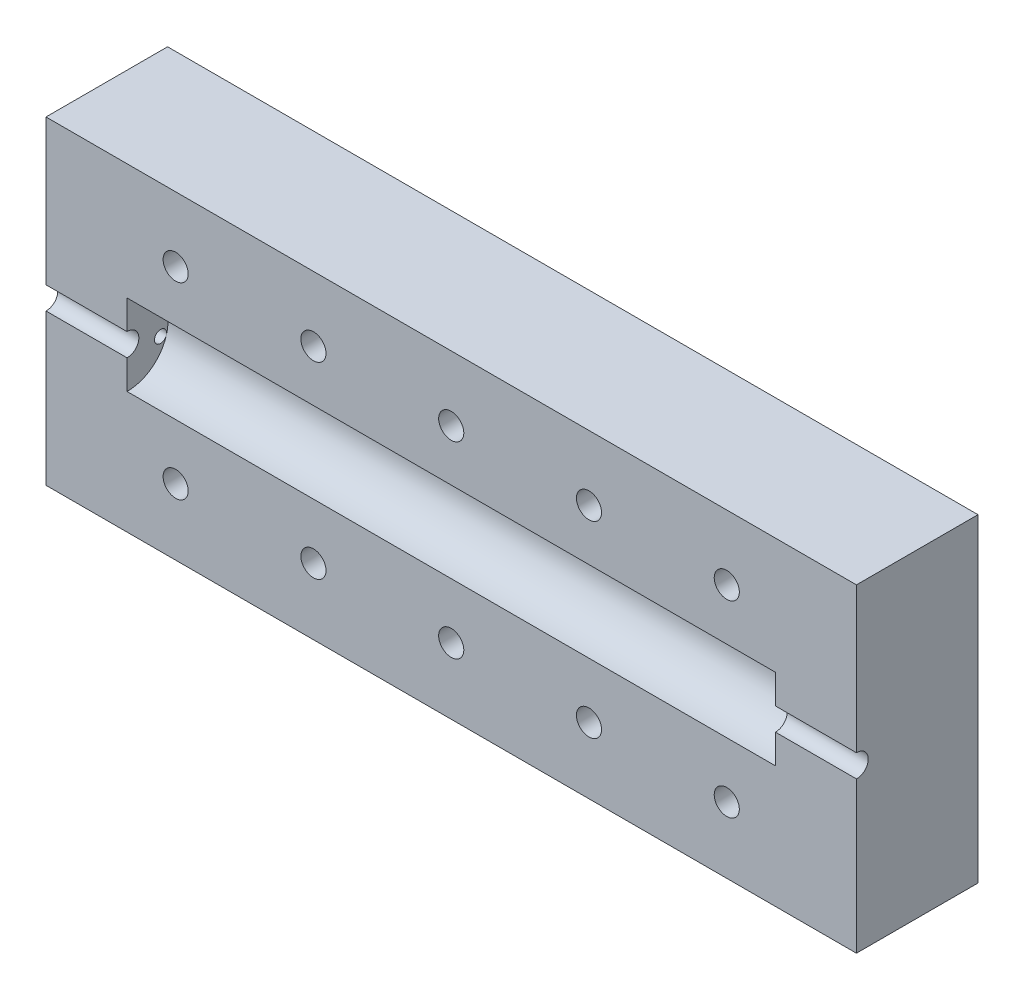
ISO-10303-21;
HEADER;
FILE_DESCRIPTION(('STEP AP214'),'2;1');
FILE_NAME('part.step','',(''),(''),'','','');
FILE_SCHEMA(('AUTOMOTIVE_DESIGN { 1 0 10303 214 1 1 1 1 }'));
ENDSEC;
DATA;
#1=APPLICATION_CONTEXT('core data for automotive mechanical design processes');
#2=APPLICATION_PROTOCOL_DEFINITION('international standard','automotive_design',2000,#1);
#3=PRODUCT_CONTEXT('',#1,'mechanical');
#4=PRODUCT('Part','Part','',(#3));
#5=PRODUCT_RELATED_PRODUCT_CATEGORY('part','',(#4));
#6=PRODUCT_DEFINITION_FORMATION('','',#4);
#7=PRODUCT_DEFINITION_CONTEXT('part definition',#1,'design');
#8=PRODUCT_DEFINITION('design','',#6,#7);
#9=PRODUCT_DEFINITION_SHAPE('','',#8);
#10=(LENGTH_UNIT() NAMED_UNIT(*) SI_UNIT(.MILLI.,.METRE.));
#11=(NAMED_UNIT(*) PLANE_ANGLE_UNIT() SI_UNIT($,.RADIAN.));
#12=(NAMED_UNIT(*) SI_UNIT($,.STERADIAN.) SOLID_ANGLE_UNIT());
#13=UNCERTAINTY_MEASURE_WITH_UNIT(LENGTH_MEASURE(1.E-05),#10,'distance_accuracy_value','');
#14=(GEOMETRIC_REPRESENTATION_CONTEXT(3) GLOBAL_UNCERTAINTY_ASSIGNED_CONTEXT((#13)) GLOBAL_UNIT_ASSIGNED_CONTEXT((#10,
#11,#12)) REPRESENTATION_CONTEXT('',''));
#15=CARTESIAN_POINT('',(0.,0.,0.));
#16=DIRECTION('',(0.,0.,1.));
#17=DIRECTION('',(1.,0.,0.));
#18=AXIS2_PLACEMENT_3D('',#15,#16,#17);
#19=CARTESIAN_POINT('',(67.,31.3641600464409,0.));
#20=DIRECTION('',(0.,0.,1.));
#21=DIRECTION('',(1.,0.,0.));
#22=AXIS2_PLACEMENT_3D('',#19,#20,#21);
#23=CYLINDRICAL_SURFACE('',#22,1.54999999999999);
#24=CARTESIAN_POINT('',(67.,31.3641600464409,15.));
#25=DIRECTION('',(0.,0.,-1.));
#26=DIRECTION('',(-1.,0.,0.));
#27=AXIS2_PLACEMENT_3D('',#24,#25,#26);
#28=CIRCLE('',#27,1.54999999999999);
#29=CARTESIAN_POINT('',(65.45,31.3641600464409,15.));
#30=VERTEX_POINT('',#29);
#31=EDGE_CURVE('E246',#30,#30,#28,.F.);
#32=ORIENTED_EDGE('',*,*,#31,.T.);
#33=EDGE_LOOP('',(#32));
#34=FACE_BOUND('',#33,.T.);
#35=CARTESIAN_POINT('',(67.,31.3641600464409,10.));
#36=DIRECTION('',(0.,0.,-1.));
#37=DIRECTION('',(-1.,0.,0.));
#38=AXIS2_PLACEMENT_3D('',#35,#36,#37);
#39=CIRCLE('',#38,1.54999999999999);
#40=CARTESIAN_POINT('',(65.45,31.3641600464409,10.));
#41=VERTEX_POINT('',#40);
#42=EDGE_CURVE('E161',#41,#41,#39,.F.);
#43=ORIENTED_EDGE('',*,*,#42,.F.);
#44=EDGE_LOOP('',(#43));
#45=FACE_BOUND('',#44,.T.);
#46=ADVANCED_FACE('F35',(#34,#45),#23,.F.);
#47=CARTESIAN_POINT('',(50.,31.3641600464409,0.));
#48=DIRECTION('',(0.,0.,1.));
#49=DIRECTION('',(1.,0.,0.));
#50=AXIS2_PLACEMENT_3D('',#47,#48,#49);
#51=CYLINDRICAL_SURFACE('',#50,1.55);
#52=CARTESIAN_POINT('',(50.,31.3641600464409,15.));
#53=DIRECTION('',(0.,0.,-1.));
#54=DIRECTION('',(-1.,0.,0.));
#55=AXIS2_PLACEMENT_3D('',#52,#53,#54);
#56=CIRCLE('',#55,1.55);
#57=CARTESIAN_POINT('',(48.45,31.3641600464409,15.));
#58=VERTEX_POINT('',#57);
#59=EDGE_CURVE('E243',#58,#58,#56,.F.);
#60=ORIENTED_EDGE('',*,*,#59,.T.);
#61=EDGE_LOOP('',(#60));
#62=FACE_BOUND('',#61,.T.);
#63=CARTESIAN_POINT('',(50.,31.3641600464409,10.));
#64=DIRECTION('',(0.,0.,-1.));
#65=DIRECTION('',(-1.,0.,0.));
#66=AXIS2_PLACEMENT_3D('',#63,#64,#65);
#67=CIRCLE('',#66,1.55);
#68=CARTESIAN_POINT('',(48.45,31.3641600464409,10.));
#69=VERTEX_POINT('',#68);
#70=EDGE_CURVE('E159',#69,#69,#67,.F.);
#71=ORIENTED_EDGE('',*,*,#70,.F.);
#72=EDGE_LOOP('',(#71));
#73=FACE_BOUND('',#72,.T.);
#74=ADVANCED_FACE('F334',(#62,#73),#51,.F.);
#75=CARTESIAN_POINT('',(33.,31.3641600464409,0.));
#76=DIRECTION('',(0.,0.,1.));
#77=DIRECTION('',(1.,0.,0.));
#78=AXIS2_PLACEMENT_3D('',#75,#76,#77);
#79=CYLINDRICAL_SURFACE('',#78,1.55);
#80=CARTESIAN_POINT('',(33.,31.3641600464409,15.));
#81=DIRECTION('',(0.,0.,-1.));
#82=DIRECTION('',(-1.,0.,0.));
#83=AXIS2_PLACEMENT_3D('',#80,#81,#82);
#84=CIRCLE('',#83,1.55);
#85=CARTESIAN_POINT('',(31.45,31.3641600464409,15.));
#86=VERTEX_POINT('',#85);
#87=EDGE_CURVE('E240',#86,#86,#84,.F.);
#88=ORIENTED_EDGE('',*,*,#87,.T.);
#89=EDGE_LOOP('',(#88));
#90=FACE_BOUND('',#89,.T.);
#91=CARTESIAN_POINT('',(33.,31.3641600464409,10.));
#92=DIRECTION('',(0.,0.,-1.));
#93=DIRECTION('',(-1.,0.,0.));
#94=AXIS2_PLACEMENT_3D('',#91,#92,#93);
#95=CIRCLE('',#94,1.55);
#96=CARTESIAN_POINT('',(31.45,31.3641600464409,10.));
#97=VERTEX_POINT('',#96);
#98=EDGE_CURVE('E155',#97,#97,#95,.F.);
#99=ORIENTED_EDGE('',*,*,#98,.F.);
#100=EDGE_LOOP('',(#99));
#101=FACE_BOUND('',#100,.T.);
#102=ADVANCED_FACE('F340',(#90,#101),#79,.F.);
#103=CARTESIAN_POINT('',(16.,31.3641600464409,0.));
#104=DIRECTION('',(0.,0.,1.));
#105=DIRECTION('',(1.,0.,0.));
#106=AXIS2_PLACEMENT_3D('',#103,#104,#105);
#107=CYLINDRICAL_SURFACE('',#106,1.55);
#108=CARTESIAN_POINT('',(16.,31.3641600464409,15.));
#109=DIRECTION('',(0.,0.,-1.));
#110=DIRECTION('',(-1.,0.,0.));
#111=AXIS2_PLACEMENT_3D('',#108,#109,#110);
#112=CIRCLE('',#111,1.55);
#113=CARTESIAN_POINT('',(14.45,31.3641600464409,15.));
#114=VERTEX_POINT('',#113);
#115=EDGE_CURVE('E237',#114,#114,#112,.F.);
#116=ORIENTED_EDGE('',*,*,#115,.T.);
#117=EDGE_LOOP('',(#116));
#118=FACE_BOUND('',#117,.T.);
#119=CARTESIAN_POINT('',(16.,31.3641600464409,10.));
#120=DIRECTION('',(0.,0.,-1.));
#121=DIRECTION('',(-1.,0.,0.));
#122=AXIS2_PLACEMENT_3D('',#119,#120,#121);
#123=CIRCLE('',#122,1.55);
#124=CARTESIAN_POINT('',(14.45,31.3641600464409,10.));
#125=VERTEX_POINT('',#124);
#126=EDGE_CURVE('E152',#125,#125,#123,.F.);
#127=ORIENTED_EDGE('',*,*,#126,.F.);
#128=EDGE_LOOP('',(#127));
#129=FACE_BOUND('',#128,.T.);
#130=ADVANCED_FACE('F389',(#118,#129),#107,.F.);
#131=CARTESIAN_POINT('',(0.,39.3641600464409,30.));
#132=DIRECTION('',(0.,-1.,0.));
#133=DIRECTION('',(0.,0.,-1.));
#134=AXIS2_PLACEMENT_3D('',#131,#132,#133);
#135=PLANE('',#134);
#136=DIRECTION('',(0.,0.,-1.));
#137=VECTOR('',#136,1.);
#138=CARTESIAN_POINT('',(0.,39.3641600464409,30.));
#139=LINE('',#138,#137);
#140=CARTESIAN_POINT('',(0.,39.3641600464409,15.));
#141=VERTEX_POINT('',#140);
#142=CARTESIAN_POINT('',(0.,39.3641600464409,0.));
#143=VERTEX_POINT('',#142);
#144=EDGE_CURVE('E143',#141,#143,#139,.T.);
#145=ORIENTED_EDGE('',*,*,#144,.F.);
#146=DIRECTION('',(-1.,0.,0.));
#147=VECTOR('',#146,1.);
#148=CARTESIAN_POINT('',(100.,39.3641600464409,15.));
#149=LINE('',#148,#147);
#150=CARTESIAN_POINT('',(100.,39.3641600464409,15.));
#151=VERTEX_POINT('',#150);
#152=EDGE_CURVE('E124',#151,#141,#149,.T.);
#153=ORIENTED_EDGE('',*,*,#152,.F.);
#154=DIRECTION('',(0.,0.,-1.));
#155=VECTOR('',#154,1.);
#156=CARTESIAN_POINT('',(100.,39.3641600464409,30.));
#157=LINE('',#156,#155);
#158=CARTESIAN_POINT('',(100.,39.3641600464409,0.));
#159=VERTEX_POINT('',#158);
#160=EDGE_CURVE('E141',#151,#159,#157,.T.);
#161=ORIENTED_EDGE('',*,*,#160,.T.);
#162=DIRECTION('',(-1.,0.,0.));
#163=VECTOR('',#162,1.);
#164=CARTESIAN_POINT('',(0.,39.3641600464409,0.));
#165=LINE('',#164,#163);
#166=EDGE_CURVE('E202',#159,#143,#165,.T.);
#167=ORIENTED_EDGE('',*,*,#166,.T.);
#168=EDGE_LOOP('',(#145,#153,#161,#167));
#169=FACE_BOUND('',#168,.T.);
#170=ADVANCED_FACE('F211',(#169),#135,.F.);
#171=CARTESIAN_POINT('',(84.,31.3641600464409,0.));
#172=DIRECTION('',(0.,0.,1.));
#173=DIRECTION('',(1.,0.,0.));
#174=AXIS2_PLACEMENT_3D('',#171,#172,#173);
#175=CYLINDRICAL_SURFACE('',#174,1.54999999999999);
#176=CARTESIAN_POINT('',(84.,31.3641600464409,15.));
#177=DIRECTION('',(0.,0.,-1.));
#178=DIRECTION('',(-1.,0.,0.));
#179=AXIS2_PLACEMENT_3D('',#176,#177,#178);
#180=CIRCLE('',#179,1.54999999999999);
#181=CARTESIAN_POINT('',(82.45,31.3641600464409,15.));
#182=VERTEX_POINT('',#181);
#183=EDGE_CURVE('E234',#182,#182,#180,.F.);
#184=ORIENTED_EDGE('',*,*,#183,.T.);
#185=EDGE_LOOP('',(#184));
#186=FACE_BOUND('',#185,.T.);
#187=CARTESIAN_POINT('',(84.,31.3641600464409,10.));
#188=DIRECTION('',(0.,0.,-1.));
#189=DIRECTION('',(-1.,0.,0.));
#190=AXIS2_PLACEMENT_3D('',#187,#188,#189);
#191=CIRCLE('',#190,1.54999999999999);
#192=CARTESIAN_POINT('',(82.45,31.3641600464409,10.));
#193=VERTEX_POINT('',#192);
#194=EDGE_CURVE('E147',#193,#193,#191,.F.);
#195=ORIENTED_EDGE('',*,*,#194,.F.);
#196=EDGE_LOOP('',(#195));
#197=FACE_BOUND('',#196,.T.);
#198=ADVANCED_FACE('F346',(#186,#197),#175,.F.);
#199=CARTESIAN_POINT('',(0.,0.,30.));
#200=DIRECTION('',(1.,0.,0.));
#201=DIRECTION('',(0.,0.,-1.));
#202=AXIS2_PLACEMENT_3D('',#199,#200,#201);
#203=PLANE('',#202);
#204=CARTESIAN_POINT('',(0.,18.842582576874,10.8641591800229));
#205=DIRECTION('',(-1.,0.,0.));
#206=DIRECTION('',(0.,0.,1.));
#207=AXIS2_PLACEMENT_3D('',#204,#205,#206);
#208=CIRCLE('',#207,0.75);
#209=CARTESIAN_POINT('',(0.,18.842582576874,11.6141591800229));
#210=VERTEX_POINT('',#209);
#211=EDGE_CURVE('E150',#210,#210,#208,.T.);
#212=ORIENTED_EDGE('',*,*,#211,.F.);
#213=EDGE_LOOP('',(#212));
#214=FACE_BOUND('',#213,.T.);
#215=DIRECTION('',(0.,0.,-1.));
#216=VECTOR('',#215,1.);
#217=CARTESIAN_POINT('',(0.,0.,30.));
#218=LINE('',#217,#216);
#219=CARTESIAN_POINT('',(0.,0.,15.));
#220=VERTEX_POINT('',#219);
#221=CARTESIAN_POINT('',(0.,0.,0.));
#222=VERTEX_POINT('',#221);
#223=EDGE_CURVE('E11',#220,#222,#218,.T.);
#224=ORIENTED_EDGE('',*,*,#223,.F.);
#225=DIRECTION('',(0.,-1.,0.));
#226=VECTOR('',#225,1.);
#227=CARTESIAN_POINT('',(0.,0.,15.));
#228=LINE('',#227,#226);
#229=CARTESIAN_POINT('',(0.,18.6280964517819,15.));
#230=VERTEX_POINT('',#229);
#231=EDGE_CURVE('E120',#230,#220,#228,.T.);
#232=ORIENTED_EDGE('',*,*,#231,.F.);
#233=CARTESIAN_POINT('',(0.,20.0270457392273,14.9457700160811));
#234=DIRECTION('',(-1.,0.,0.));
#235=DIRECTION('',(0.,0.,1.));
#236=AXIS2_PLACEMENT_3D('',#233,#234,#235);
#237=CIRCLE('',#236,1.4);
#238=CARTESIAN_POINT('',(0.,21.4259950266728,15.));
#239=VERTEX_POINT('',#238);
#240=EDGE_CURVE('E180',#239,#230,#237,.T.);
#241=ORIENTED_EDGE('',*,*,#240,.F.);
#242=EDGE_CURVE('E60',#141,#239,#228,.T.);
#243=ORIENTED_EDGE('',*,*,#242,.F.);
#244=ORIENTED_EDGE('',*,*,#144,.T.);
#245=DIRECTION('',(0.,-1.,0.));
#246=VECTOR('',#245,1.);
#247=CARTESIAN_POINT('',(0.,0.,0.));
#248=LINE('',#247,#246);
#249=EDGE_CURVE('E196',#143,#222,#248,.T.);
#250=ORIENTED_EDGE('',*,*,#249,.T.);
#251=EDGE_LOOP('',(#224,#232,#241,#243,#244,#250));
#252=FACE_BOUND('',#251,.T.);
#253=ADVANCED_FACE('F37',(#214,#252),#203,.F.);
#254=CARTESIAN_POINT('',(0.,0.,30.));
#255=DIRECTION('',(0.,1.,0.));
#256=DIRECTION('',(0.,0.,1.));
#257=AXIS2_PLACEMENT_3D('',#254,#255,#256);
#258=PLANE('',#257);
#259=DIRECTION('',(0.,0.,-1.));
#260=VECTOR('',#259,1.);
#261=CARTESIAN_POINT('',(100.,0.,30.));
#262=LINE('',#261,#260);
#263=CARTESIAN_POINT('',(100.,0.,15.));
#264=VERTEX_POINT('',#263);
#265=CARTESIAN_POINT('',(100.,0.,0.));
#266=VERTEX_POINT('',#265);
#267=EDGE_CURVE('E44',#264,#266,#262,.T.);
#268=ORIENTED_EDGE('',*,*,#267,.F.);
#269=DIRECTION('',(-1.,0.,0.));
#270=VECTOR('',#269,1.);
#271=CARTESIAN_POINT('',(100.,0.,15.));
#272=LINE('',#271,#270);
#273=EDGE_CURVE('E114',#264,#220,#272,.T.);
#274=ORIENTED_EDGE('',*,*,#273,.T.);
#275=ORIENTED_EDGE('',*,*,#223,.T.);
#276=DIRECTION('',(1.,0.,0.));
#277=VECTOR('',#276,1.);
#278=CARTESIAN_POINT('',(0.,0.,0.));
#279=LINE('',#278,#277);
#280=EDGE_CURVE('E139',#222,#266,#279,.T.);
#281=ORIENTED_EDGE('',*,*,#280,.T.);
#282=EDGE_LOOP('',(#268,#274,#275,#281));
#283=FACE_BOUND('',#282,.T.);
#284=ADVANCED_FACE('F137',(#283),#258,.F.);
#285=CARTESIAN_POINT('',(100.,0.,30.));
#286=DIRECTION('',(-1.,0.,0.));
#287=DIRECTION('',(0.,0.,1.));
#288=AXIS2_PLACEMENT_3D('',#285,#286,#287);
#289=PLANE('',#288);
#290=ORIENTED_EDGE('',*,*,#160,.F.);
#291=DIRECTION('',(0.,-1.,0.));
#292=VECTOR('',#291,1.);
#293=CARTESIAN_POINT('',(100.,0.,15.));
#294=LINE('',#293,#292);
#295=CARTESIAN_POINT('',(100.,21.4259950266728,15.));
#296=VERTEX_POINT('',#295);
#297=EDGE_CURVE('E125',#151,#296,#294,.T.);
#298=ORIENTED_EDGE('',*,*,#297,.T.);
#299=CARTESIAN_POINT('',(100.,20.0270457392273,14.9457700160811));
#300=DIRECTION('',(-1.,0.,0.));
#301=DIRECTION('',(0.,0.,1.));
#302=AXIS2_PLACEMENT_3D('',#299,#300,#301);
#303=CIRCLE('',#302,1.4);
#304=CARTESIAN_POINT('',(100.,18.6280964517819,15.));
#305=VERTEX_POINT('',#304);
#306=EDGE_CURVE('E135',#296,#305,#303,.T.);
#307=ORIENTED_EDGE('',*,*,#306,.T.);
#308=EDGE_CURVE('E117',#305,#264,#294,.T.);
#309=ORIENTED_EDGE('',*,*,#308,.T.);
#310=ORIENTED_EDGE('',*,*,#267,.T.);
#311=DIRECTION('',(0.,1.,0.));
#312=VECTOR('',#311,1.);
#313=CARTESIAN_POINT('',(100.,0.,0.));
#314=LINE('',#313,#312);
#315=EDGE_CURVE('E200',#266,#159,#314,.T.);
#316=ORIENTED_EDGE('',*,*,#315,.T.);
#317=EDGE_LOOP('',(#290,#298,#307,#309,#310,#316));
#318=FACE_BOUND('',#317,.T.);
#319=ADVANCED_FACE('F130',(#318),#289,.F.);
#320=CARTESIAN_POINT('',(0.,0.,0.));
#321=DIRECTION('',(0.,0.,-1.));
#322=DIRECTION('',(-1.,0.,0.));
#323=AXIS2_PLACEMENT_3D('',#320,#321,#322);
#324=PLANE('',#323);
#325=CARTESIAN_POINT('',(84.,8.16416004644092,0.));
#326=DIRECTION('',(0.,0.,1.));
#327=DIRECTION('',(-1.,0.,0.));
#328=AXIS2_PLACEMENT_3D('',#325,#326,#327);
#329=CIRCLE('',#328,2.85);
#330=CARTESIAN_POINT('',(81.15,8.16416004644092,0.));
#331=VERTEX_POINT('',#330);
#332=EDGE_CURVE('E269',#331,#331,#329,.T.);
#333=ORIENTED_EDGE('',*,*,#332,.T.);
#334=EDGE_LOOP('',(#333));
#335=FACE_BOUND('',#334,.T.);
#336=CARTESIAN_POINT('',(67.,8.16416004644092,0.));
#337=DIRECTION('',(0.,0.,1.));
#338=DIRECTION('',(-1.,0.,0.));
#339=AXIS2_PLACEMENT_3D('',#336,#337,#338);
#340=CIRCLE('',#339,2.85);
#341=CARTESIAN_POINT('',(64.15,8.16416004644092,0.));
#342=VERTEX_POINT('',#341);
#343=EDGE_CURVE('E275',#342,#342,#340,.T.);
#344=ORIENTED_EDGE('',*,*,#343,.T.);
#345=EDGE_LOOP('',(#344));
#346=FACE_BOUND('',#345,.T.);
#347=CARTESIAN_POINT('',(50.,8.16416004644092,0.));
#348=DIRECTION('',(0.,0.,1.));
#349=DIRECTION('',(-1.,0.,0.));
#350=AXIS2_PLACEMENT_3D('',#347,#348,#349);
#351=CIRCLE('',#350,2.85);
#352=CARTESIAN_POINT('',(47.15,8.16416004644092,0.));
#353=VERTEX_POINT('',#352);
#354=EDGE_CURVE('E281',#353,#353,#351,.T.);
#355=ORIENTED_EDGE('',*,*,#354,.T.);
#356=EDGE_LOOP('',(#355));
#357=FACE_BOUND('',#356,.T.);
#358=CARTESIAN_POINT('',(33.,8.16416004644092,0.));
#359=DIRECTION('',(0.,0.,1.));
#360=DIRECTION('',(-1.,0.,0.));
#361=AXIS2_PLACEMENT_3D('',#358,#359,#360);
#362=CIRCLE('',#361,2.85);
#363=CARTESIAN_POINT('',(30.15,8.16416004644092,0.));
#364=VERTEX_POINT('',#363);
#365=EDGE_CURVE('E287',#364,#364,#362,.T.);
#366=ORIENTED_EDGE('',*,*,#365,.T.);
#367=EDGE_LOOP('',(#366));
#368=FACE_BOUND('',#367,.T.);
#369=CARTESIAN_POINT('',(16.,8.16416004644092,0.));
#370=DIRECTION('',(0.,0.,1.));
#371=DIRECTION('',(-1.,0.,0.));
#372=AXIS2_PLACEMENT_3D('',#369,#370,#371);
#373=CIRCLE('',#372,2.85);
#374=CARTESIAN_POINT('',(13.15,8.16416004644092,0.));
#375=VERTEX_POINT('',#374);
#376=EDGE_CURVE('E264',#375,#375,#373,.T.);
#377=ORIENTED_EDGE('',*,*,#376,.T.);
#378=EDGE_LOOP('',(#377));
#379=FACE_BOUND('',#378,.T.);
#380=CARTESIAN_POINT('',(67.,31.3641600464409,0.));
#381=DIRECTION('',(0.,0.,-1.));
#382=DIRECTION('',(-1.,0.,0.));
#383=AXIS2_PLACEMENT_3D('',#380,#381,#382);
#384=CIRCLE('',#383,2.85);
#385=CARTESIAN_POINT('',(64.15,31.3641600464409,0.));
#386=VERTEX_POINT('',#385);
#387=EDGE_CURVE('E297',#386,#386,#384,.T.);
#388=ORIENTED_EDGE('',*,*,#387,.F.);
#389=EDGE_LOOP('',(#388));
#390=FACE_BOUND('',#389,.T.);
#391=CARTESIAN_POINT('',(50.,31.3641600464409,0.));
#392=DIRECTION('',(0.,0.,-1.));
#393=DIRECTION('',(-1.,0.,0.));
#394=AXIS2_PLACEMENT_3D('',#391,#392,#393);
#395=CIRCLE('',#394,2.85);
#396=CARTESIAN_POINT('',(47.15,31.3641600464409,0.));
#397=VERTEX_POINT('',#396);
#398=EDGE_CURVE('E303',#397,#397,#395,.T.);
#399=ORIENTED_EDGE('',*,*,#398,.F.);
#400=EDGE_LOOP('',(#399));
#401=FACE_BOUND('',#400,.T.);
#402=CARTESIAN_POINT('',(33.,31.3641600464409,0.));
#403=DIRECTION('',(0.,0.,-1.));
#404=DIRECTION('',(-1.,0.,0.));
#405=AXIS2_PLACEMENT_3D('',#402,#403,#404);
#406=CIRCLE('',#405,2.85);
#407=CARTESIAN_POINT('',(30.15,31.3641600464409,0.));
#408=VERTEX_POINT('',#407);
#409=EDGE_CURVE('E309',#408,#408,#406,.T.);
#410=ORIENTED_EDGE('',*,*,#409,.F.);
#411=EDGE_LOOP('',(#410));
#412=FACE_BOUND('',#411,.T.);
#413=CARTESIAN_POINT('',(16.,31.3641600464409,0.));
#414=DIRECTION('',(0.,0.,-1.));
#415=DIRECTION('',(-1.,0.,0.));
#416=AXIS2_PLACEMENT_3D('',#413,#414,#415);
#417=CIRCLE('',#416,2.85);
#418=CARTESIAN_POINT('',(13.15,31.3641600464409,0.));
#419=VERTEX_POINT('',#418);
#420=EDGE_CURVE('E268',#419,#419,#417,.T.);
#421=ORIENTED_EDGE('',*,*,#420,.F.);
#422=EDGE_LOOP('',(#421));
#423=FACE_BOUND('',#422,.T.);
#424=CARTESIAN_POINT('',(84.,31.3641600464409,0.));
#425=DIRECTION('',(0.,0.,-1.));
#426=DIRECTION('',(-1.,0.,0.));
#427=AXIS2_PLACEMENT_3D('',#424,#425,#426);
#428=CIRCLE('',#427,2.85);
#429=CARTESIAN_POINT('',(81.15,31.3641600464409,0.));
#430=VERTEX_POINT('',#429);
#431=EDGE_CURVE('E163',#430,#430,#428,.T.);
#432=ORIENTED_EDGE('',*,*,#431,.F.);
#433=EDGE_LOOP('',(#432));
#434=FACE_BOUND('',#433,.T.);
#435=ORIENTED_EDGE('',*,*,#249,.F.);
#436=ORIENTED_EDGE('',*,*,#166,.F.);
#437=ORIENTED_EDGE('',*,*,#315,.F.);
#438=ORIENTED_EDGE('',*,*,#280,.F.);
#439=EDGE_LOOP('',(#435,#436,#437,#438));
#440=FACE_BOUND('',#439,.T.);
#441=ADVANCED_FACE('F213',(#335,#346,#357,#368,#379,#390,#401,#412,#423,#434,#440),#324,.T.);
#442=CARTESIAN_POINT('',(100.,20.0270457392273,14.9457700160811));
#443=DIRECTION('',(-1.,0.,0.));
#444=DIRECTION('',(0.,0.,1.));
#445=AXIS2_PLACEMENT_3D('',#442,#443,#444);
#446=CYLINDRICAL_SURFACE('',#445,1.4);
#447=CARTESIAN_POINT('',(90.,20.0270457392273,14.9457700160811));
#448=DIRECTION('',(-1.,0.,0.));
#449=DIRECTION('',(0.,0.,1.));
#450=AXIS2_PLACEMENT_3D('',#447,#448,#449);
#451=CIRCLE('',#450,1.4);
#452=CARTESIAN_POINT('',(90.,21.4259950266728,15.));
#453=VERTEX_POINT('',#452);
#454=CARTESIAN_POINT('',(90.,18.6280964517819,15.));
#455=VERTEX_POINT('',#454);
#456=EDGE_CURVE('E183',#453,#455,#451,.T.);
#457=ORIENTED_EDGE('',*,*,#456,.T.);
#458=DIRECTION('',(-1.,0.,0.));
#459=VECTOR('',#458,1.);
#460=CARTESIAN_POINT('',(100.,18.6280964517819,15.));
#461=LINE('',#460,#459);
#462=EDGE_CURVE('E219',#455,#305,#461,.F.);
#463=ORIENTED_EDGE('',*,*,#462,.T.);
#464=ORIENTED_EDGE('',*,*,#306,.F.);
#465=DIRECTION('',(-1.,0.,0.));
#466=VECTOR('',#465,1.);
#467=CARTESIAN_POINT('',(100.,21.4259950266728,15.));
#468=LINE('',#467,#466);
#469=EDGE_CURVE('E217',#296,#453,#468,.T.);
#470=ORIENTED_EDGE('',*,*,#469,.T.);
#471=EDGE_LOOP('',(#457,#463,#464,#470));
#472=FACE_BOUND('',#471,.T.);
#473=ADVANCED_FACE('F216',(#472),#446,.F.);
#474=CARTESIAN_POINT('',(10.,20.0270457392273,14.9457700160811));
#475=DIRECTION('',(1.,0.,0.));
#476=DIRECTION('',(0.,0.,-1.));
#477=AXIS2_PLACEMENT_3D('',#474,#475,#476);
#478=CYLINDRICAL_SURFACE('',#477,5.);
#479=DIRECTION('',(1.,0.,0.));
#480=VECTOR('',#479,1.);
#481=CARTESIAN_POINT('',(10.,25.0267516414624,15.));
#482=LINE('',#481,#480);
#483=CARTESIAN_POINT('',(10.,25.0267516414624,15.));
#484=VERTEX_POINT('',#483);
#485=CARTESIAN_POINT('',(90.,25.0267516414624,15.));
#486=VERTEX_POINT('',#485);
#487=EDGE_CURVE('E231',#484,#486,#482,.T.);
#488=ORIENTED_EDGE('',*,*,#487,.F.);
#489=CARTESIAN_POINT('',(10.,20.0270457392273,14.9457700160811));
#490=DIRECTION('',(-1.,0.,0.));
#491=DIRECTION('',(0.,0.,1.));
#492=AXIS2_PLACEMENT_3D('',#489,#490,#491);
#493=CIRCLE('',#492,5.);
#494=CARTESIAN_POINT('',(10.,18.6335596658705,10.1438749148361));
#495=VERTEX_POINT('',#494);
#496=EDGE_CURVE('E192',#484,#495,#493,.T.);
#497=ORIENTED_EDGE('',*,*,#496,.T.);
#498=CARTESIAN_POINT('',(10.,15.0273398369922,15.));
#499=VERTEX_POINT('',#498);
#500=EDGE_CURVE('E193',#495,#499,#493,.T.);
#501=ORIENTED_EDGE('',*,*,#500,.T.);
#502=DIRECTION('',(1.,0.,0.));
#503=VECTOR('',#502,1.);
#504=CARTESIAN_POINT('',(10.,15.0273398369922,15.));
#505=LINE('',#504,#503);
#506=CARTESIAN_POINT('',(90.,15.0273398369922,15.));
#507=VERTEX_POINT('',#506);
#508=EDGE_CURVE('E226',#507,#499,#505,.F.);
#509=ORIENTED_EDGE('',*,*,#508,.F.);
#510=CARTESIAN_POINT('',(90.,20.0270457392273,14.9457700160811));
#511=DIRECTION('',(-1.,0.,0.));
#512=DIRECTION('',(0.,0.,1.));
#513=AXIS2_PLACEMENT_3D('',#510,#511,#512);
#514=CIRCLE('',#513,5.);
#515=EDGE_CURVE('E187',#486,#507,#514,.T.);
#516=ORIENTED_EDGE('',*,*,#515,.F.);
#517=EDGE_LOOP('',(#488,#497,#501,#509,#516));
#518=FACE_BOUND('',#517,.T.);
#519=ADVANCED_FACE('F327',(#518),#478,.F.);
#520=CARTESIAN_POINT('',(10.,20.0270457392273,14.9457700160811));
#521=DIRECTION('',(-1.,0.,0.));
#522=DIRECTION('',(0.,0.,1.));
#523=AXIS2_PLACEMENT_3D('',#520,#521,#522);
#524=PLANE('',#523);
#525=ORIENTED_EDGE('',*,*,#496,.F.);
#526=DIRECTION('',(0.,-1.,0.));
#527=VECTOR('',#526,1.);
#528=CARTESIAN_POINT('',(10.,20.0270457392273,15.));
#529=LINE('',#528,#527);
#530=CARTESIAN_POINT('',(10.,21.4259950266728,15.));
#531=VERTEX_POINT('',#530);
#532=EDGE_CURVE('E224',#484,#531,#529,.T.);
#533=ORIENTED_EDGE('',*,*,#532,.T.);
#534=CARTESIAN_POINT('',(10.,20.0270457392273,14.9457700160811));
#535=DIRECTION('',(-1.,0.,0.));
#536=DIRECTION('',(0.,0.,1.));
#537=AXIS2_PLACEMENT_3D('',#534,#535,#536);
#538=CIRCLE('',#537,1.4);
#539=CARTESIAN_POINT('',(10.,18.6280964517819,15.));
#540=VERTEX_POINT('',#539);
#541=EDGE_CURVE('E177',#531,#540,#538,.T.);
#542=ORIENTED_EDGE('',*,*,#541,.T.);
#543=EDGE_CURVE('E52',#540,#499,#529,.T.);
#544=ORIENTED_EDGE('',*,*,#543,.T.);
#545=ORIENTED_EDGE('',*,*,#500,.F.);
#546=CARTESIAN_POINT('',(10.,18.842582576874,10.8641591800229));
#547=DIRECTION('',(-1.,0.,0.));
#548=DIRECTION('',(0.,0.,1.));
#549=AXIS2_PLACEMENT_3D('',#546,#547,#548);
#550=CIRCLE('',#549,0.75);
#551=EDGE_CURVE('E174',#495,#495,#550,.T.);
#552=ORIENTED_EDGE('',*,*,#551,.T.);
#553=EDGE_LOOP('',(#525,#533,#542,#544,#545,#552));
#554=FACE_BOUND('',#553,.T.);
#555=ADVANCED_FACE('F358',(#554),#524,.F.);
#556=CARTESIAN_POINT('',(90.,20.0270457392273,14.9457700160811));
#557=DIRECTION('',(-1.,0.,0.));
#558=DIRECTION('',(0.,0.,1.));
#559=AXIS2_PLACEMENT_3D('',#556,#557,#558);
#560=PLANE('',#559);
#561=DIRECTION('',(0.,-1.,0.));
#562=VECTOR('',#561,1.);
#563=CARTESIAN_POINT('',(90.,20.0270457392273,15.));
#564=LINE('',#563,#562);
#565=EDGE_CURVE('E228',#486,#453,#564,.T.);
#566=ORIENTED_EDGE('',*,*,#565,.F.);
#567=ORIENTED_EDGE('',*,*,#515,.T.);
#568=EDGE_CURVE('E222',#455,#507,#564,.T.);
#569=ORIENTED_EDGE('',*,*,#568,.F.);
#570=ORIENTED_EDGE('',*,*,#456,.F.);
#571=EDGE_LOOP('',(#566,#567,#569,#570));
#572=FACE_BOUND('',#571,.T.);
#573=ADVANCED_FACE('F353',(#572),#560,.T.);
#574=CARTESIAN_POINT('',(0.,20.0270457392273,14.9457700160811));
#575=DIRECTION('',(1.,0.,0.));
#576=DIRECTION('',(0.,0.,-1.));
#577=AXIS2_PLACEMENT_3D('',#574,#575,#576);
#578=CYLINDRICAL_SURFACE('',#577,1.4);
#579=DIRECTION('',(1.,0.,0.));
#580=VECTOR('',#579,1.);
#581=CARTESIAN_POINT('',(0.,21.4259950266728,15.));
#582=LINE('',#581,#580);
#583=EDGE_CURVE('E221',#239,#531,#582,.T.);
#584=ORIENTED_EDGE('',*,*,#583,.F.);
#585=ORIENTED_EDGE('',*,*,#240,.T.);
#586=DIRECTION('',(1.,0.,0.));
#587=VECTOR('',#586,1.);
#588=CARTESIAN_POINT('',(0.,18.6280964517819,15.));
#589=LINE('',#588,#587);
#590=EDGE_CURVE('E551',#540,#230,#589,.F.);
#591=ORIENTED_EDGE('',*,*,#590,.F.);
#592=ORIENTED_EDGE('',*,*,#541,.F.);
#593=EDGE_LOOP('',(#584,#585,#591,#592));
#594=FACE_BOUND('',#593,.T.);
#595=ADVANCED_FACE('F350',(#594),#578,.F.);
#596=CARTESIAN_POINT('',(10.,18.842582576874,10.8641591800229));
#597=DIRECTION('',(-1.,0.,0.));
#598=DIRECTION('',(0.,0.,1.));
#599=AXIS2_PLACEMENT_3D('',#596,#597,#598);
#600=CYLINDRICAL_SURFACE('',#599,0.75);
#601=ORIENTED_EDGE('',*,*,#551,.F.);
#602=EDGE_LOOP('',(#601));
#603=FACE_BOUND('',#602,.T.);
#604=ORIENTED_EDGE('',*,*,#211,.T.);
#605=EDGE_LOOP('',(#604));
#606=FACE_BOUND('',#605,.T.);
#607=ADVANCED_FACE('F352',(#603,#606),#600,.F.);
#608=CARTESIAN_POINT('',(84.,31.3641600464409,10.));
#609=DIRECTION('',(0.,0.,-1.));
#610=DIRECTION('',(-1.,0.,0.));
#611=AXIS2_PLACEMENT_3D('',#608,#609,#610);
#612=PLANE('',#611);
#613=CARTESIAN_POINT('',(84.,31.3641600464409,10.));
#614=DIRECTION('',(0.,0.,-1.));
#615=DIRECTION('',(-1.,0.,0.));
#616=AXIS2_PLACEMENT_3D('',#613,#614,#615);
#617=CIRCLE('',#616,2.85);
#618=CARTESIAN_POINT('',(81.15,31.3641600464409,10.));
#619=VERTEX_POINT('',#618);
#620=EDGE_CURVE('E151',#619,#619,#617,.T.);
#621=ORIENTED_EDGE('',*,*,#620,.T.);
#622=EDGE_LOOP('',(#621));
#623=FACE_BOUND('',#622,.T.);
#624=ORIENTED_EDGE('',*,*,#194,.T.);
#625=EDGE_LOOP('',(#624));
#626=FACE_BOUND('',#625,.T.);
#627=ADVANCED_FACE('F378',(#623,#626),#612,.T.);
#628=CARTESIAN_POINT('',(84.,31.3641600464409,10.));
#629=DIRECTION('',(0.,0.,-1.));
#630=DIRECTION('',(-1.,0.,0.));
#631=AXIS2_PLACEMENT_3D('',#628,#629,#630);
#632=CYLINDRICAL_SURFACE('',#631,2.85);
#633=ORIENTED_EDGE('',*,*,#620,.F.);
#634=EDGE_LOOP('',(#633));
#635=FACE_BOUND('',#634,.T.);
#636=ORIENTED_EDGE('',*,*,#431,.T.);
#637=EDGE_LOOP('',(#636));
#638=FACE_BOUND('',#637,.T.);
#639=ADVANCED_FACE('F401',(#635,#638),#632,.F.);
#640=CARTESIAN_POINT('',(16.,31.3641600464409,10.));
#641=DIRECTION('',(0.,0.,-1.));
#642=DIRECTION('',(-1.,0.,0.));
#643=AXIS2_PLACEMENT_3D('',#640,#641,#642);
#644=PLANE('',#643);
#645=CARTESIAN_POINT('',(16.,31.3641600464409,10.));
#646=DIRECTION('',(0.,0.,-1.));
#647=DIRECTION('',(-1.,0.,0.));
#648=AXIS2_PLACEMENT_3D('',#645,#646,#647);
#649=CIRCLE('',#648,2.85);
#650=CARTESIAN_POINT('',(13.15,31.3641600464409,10.));
#651=VERTEX_POINT('',#650);
#652=EDGE_CURVE('E312',#651,#651,#649,.T.);
#653=ORIENTED_EDGE('',*,*,#652,.T.);
#654=EDGE_LOOP('',(#653));
#655=FACE_BOUND('',#654,.T.);
#656=ORIENTED_EDGE('',*,*,#126,.T.);
#657=EDGE_LOOP('',(#656));
#658=FACE_BOUND('',#657,.T.);
#659=ADVANCED_FACE('F404',(#655,#658),#644,.T.);
#660=CARTESIAN_POINT('',(16.,31.3641600464409,10.));
#661=DIRECTION('',(0.,0.,-1.));
#662=DIRECTION('',(-1.,0.,0.));
#663=AXIS2_PLACEMENT_3D('',#660,#661,#662);
#664=CYLINDRICAL_SURFACE('',#663,2.85);
#665=ORIENTED_EDGE('',*,*,#652,.F.);
#666=EDGE_LOOP('',(#665));
#667=FACE_BOUND('',#666,.T.);
#668=ORIENTED_EDGE('',*,*,#420,.T.);
#669=EDGE_LOOP('',(#668));
#670=FACE_BOUND('',#669,.T.);
#671=ADVANCED_FACE('F317',(#667,#670),#664,.F.);
#672=CARTESIAN_POINT('',(33.,31.3641600464409,10.));
#673=DIRECTION('',(0.,0.,-1.));
#674=DIRECTION('',(-1.,0.,0.));
#675=AXIS2_PLACEMENT_3D('',#672,#673,#674);
#676=PLANE('',#675);
#677=CARTESIAN_POINT('',(33.,31.3641600464409,10.));
#678=DIRECTION('',(0.,0.,-1.));
#679=DIRECTION('',(-1.,0.,0.));
#680=AXIS2_PLACEMENT_3D('',#677,#678,#679);
#681=CIRCLE('',#680,2.85);
#682=CARTESIAN_POINT('',(30.15,31.3641600464409,10.));
#683=VERTEX_POINT('',#682);
#684=EDGE_CURVE('E306',#683,#683,#681,.T.);
#685=ORIENTED_EDGE('',*,*,#684,.T.);
#686=EDGE_LOOP('',(#685));
#687=FACE_BOUND('',#686,.T.);
#688=ORIENTED_EDGE('',*,*,#98,.T.);
#689=EDGE_LOOP('',(#688));
#690=FACE_BOUND('',#689,.T.);
#691=ADVANCED_FACE('F411',(#687,#690),#676,.T.);
#692=CARTESIAN_POINT('',(33.,31.3641600464409,10.));
#693=DIRECTION('',(0.,0.,-1.));
#694=DIRECTION('',(-1.,0.,0.));
#695=AXIS2_PLACEMENT_3D('',#692,#693,#694);
#696=CYLINDRICAL_SURFACE('',#695,2.85);
#697=ORIENTED_EDGE('',*,*,#684,.F.);
#698=EDGE_LOOP('',(#697));
#699=FACE_BOUND('',#698,.T.);
#700=ORIENTED_EDGE('',*,*,#409,.T.);
#701=EDGE_LOOP('',(#700));
#702=FACE_BOUND('',#701,.T.);
#703=ADVANCED_FACE('F416',(#699,#702),#696,.F.);
#704=CARTESIAN_POINT('',(50.,31.3641600464409,10.));
#705=DIRECTION('',(0.,0.,-1.));
#706=DIRECTION('',(-1.,0.,0.));
#707=AXIS2_PLACEMENT_3D('',#704,#705,#706);
#708=PLANE('',#707);
#709=CARTESIAN_POINT('',(50.,31.3641600464409,10.));
#710=DIRECTION('',(0.,0.,-1.));
#711=DIRECTION('',(-1.,0.,0.));
#712=AXIS2_PLACEMENT_3D('',#709,#710,#711);
#713=CIRCLE('',#712,2.85);
#714=CARTESIAN_POINT('',(47.15,31.3641600464409,10.));
#715=VERTEX_POINT('',#714);
#716=EDGE_CURVE('E300',#715,#715,#713,.T.);
#717=ORIENTED_EDGE('',*,*,#716,.T.);
#718=EDGE_LOOP('',(#717));
#719=FACE_BOUND('',#718,.T.);
#720=ORIENTED_EDGE('',*,*,#70,.T.);
#721=EDGE_LOOP('',(#720));
#722=FACE_BOUND('',#721,.T.);
#723=ADVANCED_FACE('F419',(#719,#722),#708,.T.);
#724=CARTESIAN_POINT('',(50.,31.3641600464409,10.));
#725=DIRECTION('',(0.,0.,-1.));
#726=DIRECTION('',(-1.,0.,0.));
#727=AXIS2_PLACEMENT_3D('',#724,#725,#726);
#728=CYLINDRICAL_SURFACE('',#727,2.85);
#729=ORIENTED_EDGE('',*,*,#716,.F.);
#730=EDGE_LOOP('',(#729));
#731=FACE_BOUND('',#730,.T.);
#732=ORIENTED_EDGE('',*,*,#398,.T.);
#733=EDGE_LOOP('',(#732));
#734=FACE_BOUND('',#733,.T.);
#735=ADVANCED_FACE('F424',(#731,#734),#728,.F.);
#736=CARTESIAN_POINT('',(67.,31.3641600464409,10.));
#737=DIRECTION('',(0.,0.,-1.));
#738=DIRECTION('',(-1.,0.,0.));
#739=AXIS2_PLACEMENT_3D('',#736,#737,#738);
#740=PLANE('',#739);
#741=CARTESIAN_POINT('',(67.,31.3641600464409,10.));
#742=DIRECTION('',(0.,0.,-1.));
#743=DIRECTION('',(-1.,0.,0.));
#744=AXIS2_PLACEMENT_3D('',#741,#742,#743);
#745=CIRCLE('',#744,2.85);
#746=CARTESIAN_POINT('',(64.15,31.3641600464409,10.));
#747=VERTEX_POINT('',#746);
#748=EDGE_CURVE('E156',#747,#747,#745,.T.);
#749=ORIENTED_EDGE('',*,*,#748,.T.);
#750=EDGE_LOOP('',(#749));
#751=FACE_BOUND('',#750,.T.);
#752=ORIENTED_EDGE('',*,*,#42,.T.);
#753=EDGE_LOOP('',(#752));
#754=FACE_BOUND('',#753,.T.);
#755=ADVANCED_FACE('F427',(#751,#754),#740,.T.);
#756=CARTESIAN_POINT('',(67.,31.3641600464409,10.));
#757=DIRECTION('',(0.,0.,-1.));
#758=DIRECTION('',(-1.,0.,0.));
#759=AXIS2_PLACEMENT_3D('',#756,#757,#758);
#760=CYLINDRICAL_SURFACE('',#759,2.85);
#761=ORIENTED_EDGE('',*,*,#748,.F.);
#762=EDGE_LOOP('',(#761));
#763=FACE_BOUND('',#762,.T.);
#764=ORIENTED_EDGE('',*,*,#387,.T.);
#765=EDGE_LOOP('',(#764));
#766=FACE_BOUND('',#765,.T.);
#767=ADVANCED_FACE('F432',(#763,#766),#760,.F.);
#768=CARTESIAN_POINT('',(16.,8.16416004644092,10.));
#769=DIRECTION('',(0.,0.,-1.));
#770=DIRECTION('',(-1.,0.,0.));
#771=AXIS2_PLACEMENT_3D('',#768,#769,#770);
#772=CYLINDRICAL_SURFACE('',#771,2.85);
#773=CARTESIAN_POINT('',(16.,8.16416004644092,10.));
#774=DIRECTION('',(0.,0.,1.));
#775=DIRECTION('',(-1.,0.,0.));
#776=AXIS2_PLACEMENT_3D('',#773,#774,#775);
#777=CIRCLE('',#776,2.85);
#778=CARTESIAN_POINT('',(13.15,8.16416004644092,10.));
#779=VERTEX_POINT('',#778);
#780=EDGE_CURVE('E290',#779,#779,#777,.T.);
#781=ORIENTED_EDGE('',*,*,#780,.T.);
#782=EDGE_LOOP('',(#781));
#783=FACE_BOUND('',#782,.T.);
#784=ORIENTED_EDGE('',*,*,#376,.F.);
#785=EDGE_LOOP('',(#784));
#786=FACE_BOUND('',#785,.T.);
#787=ADVANCED_FACE('F435',(#783,#786),#772,.F.);
#788=CARTESIAN_POINT('',(16.,8.16416004644092,10.));
#789=DIRECTION('',(0.,0.,-1.));
#790=DIRECTION('',(-1.,0.,0.));
#791=AXIS2_PLACEMENT_3D('',#788,#789,#790);
#792=PLANE('',#791);
#793=CARTESIAN_POINT('',(16.,8.16416004644092,10.));
#794=DIRECTION('',(0.,0.,-1.));
#795=DIRECTION('',(-1.,0.,0.));
#796=AXIS2_PLACEMENT_3D('',#793,#794,#795);
#797=CIRCLE('',#796,1.55);
#798=CARTESIAN_POINT('',(14.45,8.16416004644092,10.));
#799=VERTEX_POINT('',#798);
#800=EDGE_CURVE('E249',#799,#799,#797,.F.);
#801=ORIENTED_EDGE('',*,*,#800,.T.);
#802=EDGE_LOOP('',(#801));
#803=FACE_BOUND('',#802,.T.);
#804=ORIENTED_EDGE('',*,*,#780,.F.);
#805=EDGE_LOOP('',(#804));
#806=FACE_BOUND('',#805,.T.);
#807=ADVANCED_FACE('F442',(#803,#806),#792,.T.);
#808=CARTESIAN_POINT('',(33.,8.16416004644092,10.));
#809=DIRECTION('',(0.,0.,-1.));
#810=DIRECTION('',(-1.,0.,0.));
#811=AXIS2_PLACEMENT_3D('',#808,#809,#810);
#812=CYLINDRICAL_SURFACE('',#811,2.85);
#813=CARTESIAN_POINT('',(33.,8.16416004644092,10.));
#814=DIRECTION('',(0.,0.,1.));
#815=DIRECTION('',(-1.,0.,0.));
#816=AXIS2_PLACEMENT_3D('',#813,#814,#815);
#817=CIRCLE('',#816,2.85);
#818=CARTESIAN_POINT('',(30.15,8.16416004644092,10.));
#819=VERTEX_POINT('',#818);
#820=EDGE_CURVE('E284',#819,#819,#817,.T.);
#821=ORIENTED_EDGE('',*,*,#820,.T.);
#822=EDGE_LOOP('',(#821));
#823=FACE_BOUND('',#822,.T.);
#824=ORIENTED_EDGE('',*,*,#365,.F.);
#825=EDGE_LOOP('',(#824));
#826=FACE_BOUND('',#825,.T.);
#827=ADVANCED_FACE('F446',(#823,#826),#812,.F.);
#828=CARTESIAN_POINT('',(33.,8.16416004644092,10.));
#829=DIRECTION('',(0.,0.,-1.));
#830=DIRECTION('',(-1.,0.,0.));
#831=AXIS2_PLACEMENT_3D('',#828,#829,#830);
#832=PLANE('',#831);
#833=CARTESIAN_POINT('',(33.,8.16416004644092,10.));
#834=DIRECTION('',(0.,0.,-1.));
#835=DIRECTION('',(-1.,0.,0.));
#836=AXIS2_PLACEMENT_3D('',#833,#834,#835);
#837=CIRCLE('',#836,1.55);
#838=CARTESIAN_POINT('',(31.45,8.16416004644092,10.));
#839=VERTEX_POINT('',#838);
#840=EDGE_CURVE('E252',#839,#839,#837,.F.);
#841=ORIENTED_EDGE('',*,*,#840,.T.);
#842=EDGE_LOOP('',(#841));
#843=FACE_BOUND('',#842,.T.);
#844=ORIENTED_EDGE('',*,*,#820,.F.);
#845=EDGE_LOOP('',(#844));
#846=FACE_BOUND('',#845,.T.);
#847=ADVANCED_FACE('F450',(#843,#846),#832,.T.);
#848=CARTESIAN_POINT('',(50.,8.16416004644092,10.));
#849=DIRECTION('',(0.,0.,-1.));
#850=DIRECTION('',(-1.,0.,0.));
#851=AXIS2_PLACEMENT_3D('',#848,#849,#850);
#852=CYLINDRICAL_SURFACE('',#851,2.85);
#853=CARTESIAN_POINT('',(50.,8.16416004644092,10.));
#854=DIRECTION('',(0.,0.,1.));
#855=DIRECTION('',(-1.,0.,0.));
#856=AXIS2_PLACEMENT_3D('',#853,#854,#855);
#857=CIRCLE('',#856,2.85);
#858=CARTESIAN_POINT('',(47.15,8.16416004644092,10.));
#859=VERTEX_POINT('',#858);
#860=EDGE_CURVE('E278',#859,#859,#857,.T.);
#861=ORIENTED_EDGE('',*,*,#860,.T.);
#862=EDGE_LOOP('',(#861));
#863=FACE_BOUND('',#862,.T.);
#864=ORIENTED_EDGE('',*,*,#354,.F.);
#865=EDGE_LOOP('',(#864));
#866=FACE_BOUND('',#865,.T.);
#867=ADVANCED_FACE('F454',(#863,#866),#852,.F.);
#868=CARTESIAN_POINT('',(50.,8.16416004644092,10.));
#869=DIRECTION('',(0.,0.,-1.));
#870=DIRECTION('',(-1.,0.,0.));
#871=AXIS2_PLACEMENT_3D('',#868,#869,#870);
#872=PLANE('',#871);
#873=CARTESIAN_POINT('',(50.,8.16416004644092,10.));
#874=DIRECTION('',(0.,0.,-1.));
#875=DIRECTION('',(-1.,0.,0.));
#876=AXIS2_PLACEMENT_3D('',#873,#874,#875);
#877=CIRCLE('',#876,1.55);
#878=CARTESIAN_POINT('',(48.45,8.16416004644092,10.));
#879=VERTEX_POINT('',#878);
#880=EDGE_CURVE('E255',#879,#879,#877,.F.);
#881=ORIENTED_EDGE('',*,*,#880,.T.);
#882=EDGE_LOOP('',(#881));
#883=FACE_BOUND('',#882,.T.);
#884=ORIENTED_EDGE('',*,*,#860,.F.);
#885=EDGE_LOOP('',(#884));
#886=FACE_BOUND('',#885,.T.);
#887=ADVANCED_FACE('F458',(#883,#886),#872,.T.);
#888=CARTESIAN_POINT('',(67.,8.16416004644092,10.));
#889=DIRECTION('',(0.,0.,-1.));
#890=DIRECTION('',(-1.,0.,0.));
#891=AXIS2_PLACEMENT_3D('',#888,#889,#890);
#892=CYLINDRICAL_SURFACE('',#891,2.85);
#893=CARTESIAN_POINT('',(67.,8.16416004644092,10.));
#894=DIRECTION('',(0.,0.,1.));
#895=DIRECTION('',(-1.,0.,0.));
#896=AXIS2_PLACEMENT_3D('',#893,#894,#895);
#897=CIRCLE('',#896,2.85);
#898=CARTESIAN_POINT('',(64.15,8.16416004644092,10.));
#899=VERTEX_POINT('',#898);
#900=EDGE_CURVE('E272',#899,#899,#897,.T.);
#901=ORIENTED_EDGE('',*,*,#900,.T.);
#902=EDGE_LOOP('',(#901));
#903=FACE_BOUND('',#902,.T.);
#904=ORIENTED_EDGE('',*,*,#343,.F.);
#905=EDGE_LOOP('',(#904));
#906=FACE_BOUND('',#905,.T.);
#907=ADVANCED_FACE('F462',(#903,#906),#892,.F.);
#908=CARTESIAN_POINT('',(67.,8.16416004644092,10.));
#909=DIRECTION('',(0.,0.,-1.));
#910=DIRECTION('',(-1.,0.,0.));
#911=AXIS2_PLACEMENT_3D('',#908,#909,#910);
#912=PLANE('',#911);
#913=CARTESIAN_POINT('',(67.,8.16416004644092,10.));
#914=DIRECTION('',(0.,0.,-1.));
#915=DIRECTION('',(-1.,0.,0.));
#916=AXIS2_PLACEMENT_3D('',#913,#914,#915);
#917=CIRCLE('',#916,1.54999999999999);
#918=CARTESIAN_POINT('',(65.45,8.16416004644092,10.));
#919=VERTEX_POINT('',#918);
#920=EDGE_CURVE('E258',#919,#919,#917,.F.);
#921=ORIENTED_EDGE('',*,*,#920,.T.);
#922=EDGE_LOOP('',(#921));
#923=FACE_BOUND('',#922,.T.);
#924=ORIENTED_EDGE('',*,*,#900,.F.);
#925=EDGE_LOOP('',(#924));
#926=FACE_BOUND('',#925,.T.);
#927=ADVANCED_FACE('F466',(#923,#926),#912,.T.);
#928=CARTESIAN_POINT('',(84.,8.16416004644092,10.));
#929=DIRECTION('',(0.,0.,-1.));
#930=DIRECTION('',(-1.,0.,0.));
#931=AXIS2_PLACEMENT_3D('',#928,#929,#930);
#932=CYLINDRICAL_SURFACE('',#931,2.85);
#933=CARTESIAN_POINT('',(84.,8.16416004644092,10.));
#934=DIRECTION('',(0.,0.,1.));
#935=DIRECTION('',(-1.,0.,0.));
#936=AXIS2_PLACEMENT_3D('',#933,#934,#935);
#937=CIRCLE('',#936,2.85);
#938=CARTESIAN_POINT('',(81.15,8.16416004644092,10.));
#939=VERTEX_POINT('',#938);
#940=EDGE_CURVE('E265',#939,#939,#937,.T.);
#941=ORIENTED_EDGE('',*,*,#940,.T.);
#942=EDGE_LOOP('',(#941));
#943=FACE_BOUND('',#942,.T.);
#944=ORIENTED_EDGE('',*,*,#332,.F.);
#945=EDGE_LOOP('',(#944));
#946=FACE_BOUND('',#945,.T.);
#947=ADVANCED_FACE('F470',(#943,#946),#932,.F.);
#948=CARTESIAN_POINT('',(84.,8.16416004644092,10.));
#949=DIRECTION('',(0.,0.,-1.));
#950=DIRECTION('',(-1.,0.,0.));
#951=AXIS2_PLACEMENT_3D('',#948,#949,#950);
#952=PLANE('',#951);
#953=CARTESIAN_POINT('',(84.,8.16416004644092,10.));
#954=DIRECTION('',(0.,0.,-1.));
#955=DIRECTION('',(-1.,0.,0.));
#956=AXIS2_PLACEMENT_3D('',#953,#954,#955);
#957=CIRCLE('',#956,1.54999999999999);
#958=CARTESIAN_POINT('',(82.45,8.16416004644092,10.));
#959=VERTEX_POINT('',#958);
#960=EDGE_CURVE('E261',#959,#959,#957,.F.);
#961=ORIENTED_EDGE('',*,*,#960,.T.);
#962=EDGE_LOOP('',(#961));
#963=FACE_BOUND('',#962,.T.);
#964=ORIENTED_EDGE('',*,*,#940,.F.);
#965=EDGE_LOOP('',(#964));
#966=FACE_BOUND('',#965,.T.);
#967=ADVANCED_FACE('F474',(#963,#966),#952,.T.);
#968=CARTESIAN_POINT('',(16.,8.16416004644092,0.));
#969=DIRECTION('',(0.,0.,1.));
#970=DIRECTION('',(1.,0.,0.));
#971=AXIS2_PLACEMENT_3D('',#968,#969,#970);
#972=CYLINDRICAL_SURFACE('',#971,1.55);
#973=CARTESIAN_POINT('',(16.,8.16416004644092,15.));
#974=DIRECTION('',(0.,0.,-1.));
#975=DIRECTION('',(-1.,0.,0.));
#976=AXIS2_PLACEMENT_3D('',#973,#974,#975);
#977=CIRCLE('',#976,1.55);
#978=CARTESIAN_POINT('',(14.45,8.16416004644092,15.));
#979=VERTEX_POINT('',#978);
#980=EDGE_CURVE('E529',#979,#979,#977,.T.);
#981=ORIENTED_EDGE('',*,*,#980,.F.);
#982=EDGE_LOOP('',(#981));
#983=FACE_BOUND('',#982,.T.);
#984=ORIENTED_EDGE('',*,*,#800,.F.);
#985=EDGE_LOOP('',(#984));
#986=FACE_BOUND('',#985,.T.);
#987=ADVANCED_FACE('F478',(#983,#986),#972,.F.);
#988=CARTESIAN_POINT('',(33.,8.16416004644092,0.));
#989=DIRECTION('',(0.,0.,1.));
#990=DIRECTION('',(1.,0.,0.));
#991=AXIS2_PLACEMENT_3D('',#988,#989,#990);
#992=CYLINDRICAL_SURFACE('',#991,1.55);
#993=CARTESIAN_POINT('',(33.,8.16416004644092,15.));
#994=DIRECTION('',(0.,0.,-1.));
#995=DIRECTION('',(-1.,0.,0.));
#996=AXIS2_PLACEMENT_3D('',#993,#994,#995);
#997=CIRCLE('',#996,1.55);
#998=CARTESIAN_POINT('',(31.45,8.16416004644092,15.));
#999=VERTEX_POINT('',#998);
#1000=EDGE_CURVE('E533',#999,#999,#997,.T.);
#1001=ORIENTED_EDGE('',*,*,#1000,.F.);
#1002=EDGE_LOOP('',(#1001));
#1003=FACE_BOUND('',#1002,.T.);
#1004=ORIENTED_EDGE('',*,*,#840,.F.);
#1005=EDGE_LOOP('',(#1004));
#1006=FACE_BOUND('',#1005,.T.);
#1007=ADVANCED_FACE('F491',(#1003,#1006),#992,.F.);
#1008=CARTESIAN_POINT('',(50.,8.16416004644092,0.));
#1009=DIRECTION('',(0.,0.,1.));
#1010=DIRECTION('',(1.,0.,0.));
#1011=AXIS2_PLACEMENT_3D('',#1008,#1009,#1010);
#1012=CYLINDRICAL_SURFACE('',#1011,1.55);
#1013=CARTESIAN_POINT('',(50.,8.16416004644092,15.));
#1014=DIRECTION('',(0.,0.,-1.));
#1015=DIRECTION('',(-1.,0.,0.));
#1016=AXIS2_PLACEMENT_3D('',#1013,#1014,#1015);
#1017=CIRCLE('',#1016,1.55);
#1018=CARTESIAN_POINT('',(48.45,8.16416004644092,15.));
#1019=VERTEX_POINT('',#1018);
#1020=EDGE_CURVE('E537',#1019,#1019,#1017,.T.);
#1021=ORIENTED_EDGE('',*,*,#1020,.F.);
#1022=EDGE_LOOP('',(#1021));
#1023=FACE_BOUND('',#1022,.T.);
#1024=ORIENTED_EDGE('',*,*,#880,.F.);
#1025=EDGE_LOOP('',(#1024));
#1026=FACE_BOUND('',#1025,.T.);
#1027=ADVANCED_FACE('F487',(#1023,#1026),#1012,.F.);
#1028=CARTESIAN_POINT('',(67.,8.16416004644092,0.));
#1029=DIRECTION('',(0.,0.,1.));
#1030=DIRECTION('',(1.,0.,0.));
#1031=AXIS2_PLACEMENT_3D('',#1028,#1029,#1030);
#1032=CYLINDRICAL_SURFACE('',#1031,1.54999999999999);
#1033=CARTESIAN_POINT('',(67.,8.16416004644092,15.));
#1034=DIRECTION('',(0.,0.,-1.));
#1035=DIRECTION('',(-1.,0.,0.));
#1036=AXIS2_PLACEMENT_3D('',#1033,#1034,#1035);
#1037=CIRCLE('',#1036,1.54999999999999);
#1038=CARTESIAN_POINT('',(65.45,8.16416004644092,15.));
#1039=VERTEX_POINT('',#1038);
#1040=EDGE_CURVE('E541',#1039,#1039,#1037,.T.);
#1041=ORIENTED_EDGE('',*,*,#1040,.F.);
#1042=EDGE_LOOP('',(#1041));
#1043=FACE_BOUND('',#1042,.T.);
#1044=ORIENTED_EDGE('',*,*,#920,.F.);
#1045=EDGE_LOOP('',(#1044));
#1046=FACE_BOUND('',#1045,.T.);
#1047=ADVANCED_FACE('F483',(#1043,#1046),#1032,.F.);
#1048=CARTESIAN_POINT('',(84.,8.16416004644092,0.));
#1049=DIRECTION('',(0.,0.,1.));
#1050=DIRECTION('',(1.,0.,0.));
#1051=AXIS2_PLACEMENT_3D('',#1048,#1049,#1050);
#1052=CYLINDRICAL_SURFACE('',#1051,1.54999999999999);
#1053=CARTESIAN_POINT('',(84.,8.16416004644092,15.));
#1054=DIRECTION('',(0.,0.,-1.));
#1055=DIRECTION('',(-1.,0.,0.));
#1056=AXIS2_PLACEMENT_3D('',#1053,#1054,#1055);
#1057=CIRCLE('',#1056,1.54999999999999);
#1058=CARTESIAN_POINT('',(82.45,8.16416004644092,15.));
#1059=VERTEX_POINT('',#1058);
#1060=EDGE_CURVE('E39',#1059,#1059,#1057,.T.);
#1061=ORIENTED_EDGE('',*,*,#1060,.F.);
#1062=EDGE_LOOP('',(#1061));
#1063=FACE_BOUND('',#1062,.T.);
#1064=ORIENTED_EDGE('',*,*,#960,.F.);
#1065=EDGE_LOOP('',(#1064));
#1066=FACE_BOUND('',#1065,.T.);
#1067=ADVANCED_FACE('F480',(#1063,#1066),#1052,.F.);
#1068=CARTESIAN_POINT('',(100.,0.,15.));
#1069=DIRECTION('',(0.,0.,-1.));
#1070=DIRECTION('',(-1.,0.,0.));
#1071=AXIS2_PLACEMENT_3D('',#1068,#1069,#1070);
#1072=PLANE('',#1071);
#1073=ORIENTED_EDGE('',*,*,#980,.T.);
#1074=EDGE_LOOP('',(#1073));
#1075=FACE_BOUND('',#1074,.T.);
#1076=ORIENTED_EDGE('',*,*,#1000,.T.);
#1077=EDGE_LOOP('',(#1076));
#1078=FACE_BOUND('',#1077,.T.);
#1079=ORIENTED_EDGE('',*,*,#1020,.T.);
#1080=EDGE_LOOP('',(#1079));
#1081=FACE_BOUND('',#1080,.T.);
#1082=ORIENTED_EDGE('',*,*,#1040,.T.);
#1083=EDGE_LOOP('',(#1082));
#1084=FACE_BOUND('',#1083,.T.);
#1085=ORIENTED_EDGE('',*,*,#1060,.T.);
#1086=EDGE_LOOP('',(#1085));
#1087=FACE_BOUND('',#1086,.T.);
#1088=ORIENTED_EDGE('',*,*,#568,.T.);
#1089=ORIENTED_EDGE('',*,*,#508,.T.);
#1090=ORIENTED_EDGE('',*,*,#543,.F.);
#1091=ORIENTED_EDGE('',*,*,#590,.T.);
#1092=ORIENTED_EDGE('',*,*,#231,.T.);
#1093=ORIENTED_EDGE('',*,*,#273,.F.);
#1094=ORIENTED_EDGE('',*,*,#308,.F.);
#1095=ORIENTED_EDGE('',*,*,#462,.F.);
#1096=EDGE_LOOP('',(#1088,#1089,#1090,#1091,#1092,#1093,#1094,#1095));
#1097=FACE_BOUND('',#1096,.T.);
#1098=ADVANCED_FACE('F116',(#1075,#1078,#1081,#1084,#1087,#1097),#1072,.F.);
#1099=ORIENTED_EDGE('',*,*,#59,.F.);
#1100=EDGE_LOOP('',(#1099));
#1101=FACE_BOUND('',#1100,.T.);
#1102=ORIENTED_EDGE('',*,*,#115,.F.);
#1103=EDGE_LOOP('',(#1102));
#1104=FACE_BOUND('',#1103,.T.);
#1105=ORIENTED_EDGE('',*,*,#297,.F.);
#1106=ORIENTED_EDGE('',*,*,#152,.T.);
#1107=ORIENTED_EDGE('',*,*,#242,.T.);
#1108=ORIENTED_EDGE('',*,*,#583,.T.);
#1109=ORIENTED_EDGE('',*,*,#532,.F.);
#1110=ORIENTED_EDGE('',*,*,#487,.T.);
#1111=ORIENTED_EDGE('',*,*,#565,.T.);
#1112=ORIENTED_EDGE('',*,*,#469,.F.);
#1113=EDGE_LOOP('',(#1105,#1106,#1107,#1108,#1109,#1110,#1111,#1112));
#1114=FACE_BOUND('',#1113,.T.);
#1115=ORIENTED_EDGE('',*,*,#183,.F.);
#1116=EDGE_LOOP('',(#1115));
#1117=FACE_BOUND('',#1116,.T.);
#1118=ORIENTED_EDGE('',*,*,#87,.F.);
#1119=EDGE_LOOP('',(#1118));
#1120=FACE_BOUND('',#1119,.T.);
#1121=ORIENTED_EDGE('',*,*,#31,.F.);
#1122=EDGE_LOOP('',(#1121));
#1123=FACE_BOUND('',#1122,.T.);
#1124=ADVANCED_FACE('F499',(#1101,#1104,#1114,#1117,#1120,#1123),#1072,.F.);
#1125=CLOSED_SHELL('',(#46,#74,#102,#130,#170,#198,#253,#284,#319,#441,#473,#519,#555,#573,#595,
#607,#627,#639,#659,#671,#691,#703,#723,#735,#755,#767,#787,#807,#827,#847,#867,#887,#907,#927,
#947,#967,#987,#1007,#1027,#1047,#1067,#1098,#1124));
#1126=MANIFOLD_SOLID_BREP('B2',#1125);
#1127=ADVANCED_BREP_SHAPE_REPRESENTATION('',(#18,#1126),#14);
#1128=SHAPE_DEFINITION_REPRESENTATION(#9,#1127);
ENDSEC;
END-ISO-10303-21;
